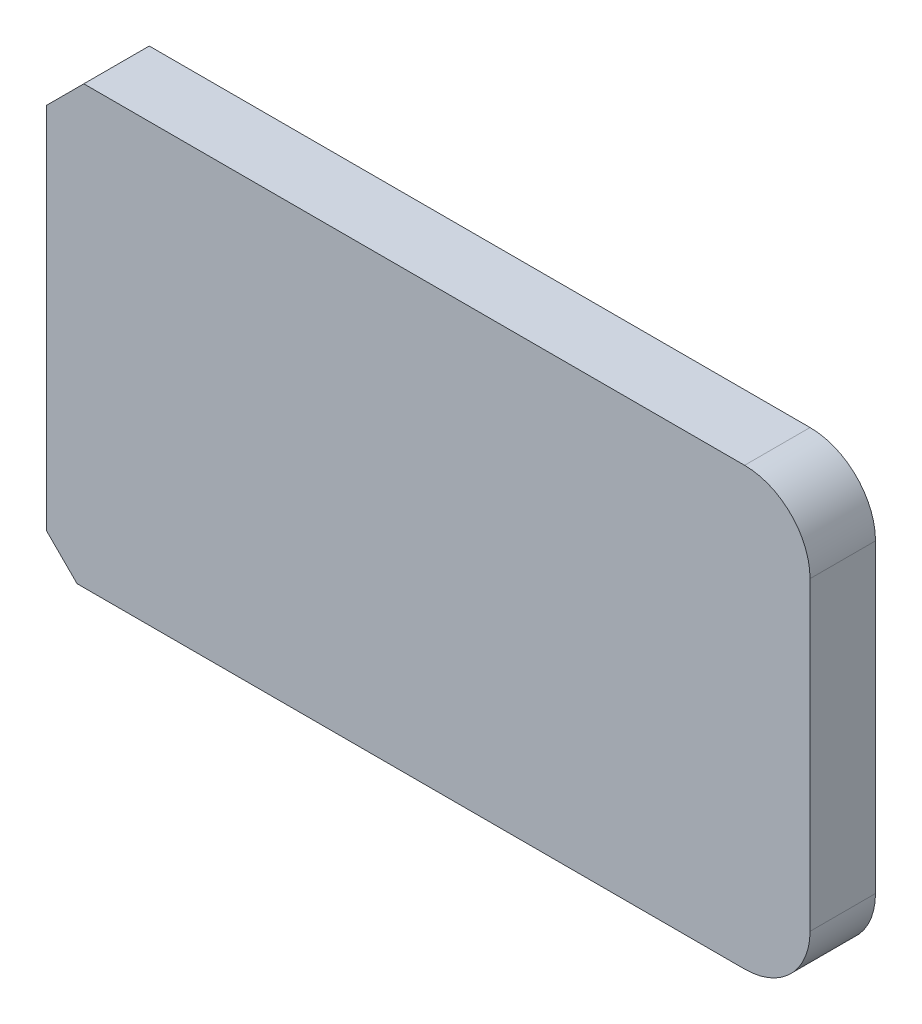
ISO-10303-21;
HEADER;
FILE_DESCRIPTION(('STEP AP214'),'2;1');
FILE_NAME('part.step','',(''),(''),'','','');
FILE_SCHEMA(('AUTOMOTIVE_DESIGN { 1 0 10303 214 1 1 1 1 }'));
ENDSEC;
DATA;
#1=APPLICATION_CONTEXT('core data for automotive mechanical design processes');
#2=APPLICATION_PROTOCOL_DEFINITION('international standard','automotive_design',2000,#1);
#3=PRODUCT_CONTEXT('',#1,'mechanical');
#4=PRODUCT('Part','Part','',(#3));
#5=PRODUCT_RELATED_PRODUCT_CATEGORY('part','',(#4));
#6=PRODUCT_DEFINITION_FORMATION('','',#4);
#7=PRODUCT_DEFINITION_CONTEXT('part definition',#1,'design');
#8=PRODUCT_DEFINITION('design','',#6,#7);
#9=PRODUCT_DEFINITION_SHAPE('','',#8);
#10=(LENGTH_UNIT() NAMED_UNIT(*) SI_UNIT(.MILLI.,.METRE.));
#11=(NAMED_UNIT(*) PLANE_ANGLE_UNIT() SI_UNIT($,.RADIAN.));
#12=(NAMED_UNIT(*) SI_UNIT($,.STERADIAN.) SOLID_ANGLE_UNIT());
#13=UNCERTAINTY_MEASURE_WITH_UNIT(LENGTH_MEASURE(1.E-05),#10,'distance_accuracy_value','');
#14=(GEOMETRIC_REPRESENTATION_CONTEXT(3) GLOBAL_UNCERTAINTY_ASSIGNED_CONTEXT((#13)) GLOBAL_UNIT_ASSIGNED_CONTEXT((#10,
#11,#12)) REPRESENTATION_CONTEXT('',''));
#15=CARTESIAN_POINT('',(0.,0.,0.));
#16=DIRECTION('',(0.,0.,1.));
#17=DIRECTION('',(1.,0.,0.));
#18=AXIS2_PLACEMENT_3D('',#15,#16,#17);
#19=CARTESIAN_POINT('',(-74.5424292845258,-25.0415973377704,12.));
#20=DIRECTION('',(1.,0.,0.));
#21=DIRECTION('',(0.,0.,-1.));
#22=AXIS2_PLACEMENT_3D('',#19,#20,#21);
#23=PLANE('',#22);
#24=DIRECTION('',(0.,-1.,0.));
#25=VECTOR('',#24,1.);
#26=CARTESIAN_POINT('',(-74.5424292845258,-25.0415973377704,0.));
#27=LINE('',#26,#25);
#28=CARTESIAN_POINT('',(-74.5424292845258,42.5124792013311,0.));
#29=VERTEX_POINT('',#28);
#30=CARTESIAN_POINT('',(-74.5424292845258,-25.0415973377704,0.));
#31=VERTEX_POINT('',#30);
#32=EDGE_CURVE('E133',#29,#31,#27,.T.);
#33=ORIENTED_EDGE('',*,*,#32,.T.);
#34=DIRECTION('',(0.,0.,-1.));
#35=VECTOR('',#34,1.);
#36=CARTESIAN_POINT('',(-74.5424292845258,-25.0415973377704,12.));
#37=LINE('',#36,#35);
#38=CARTESIAN_POINT('',(-74.5424292845258,-25.0415973377704,12.));
#39=VERTEX_POINT('',#38);
#40=EDGE_CURVE('E11',#39,#31,#37,.T.);
#41=ORIENTED_EDGE('',*,*,#40,.F.);
#42=DIRECTION('',(0.,-1.,0.));
#43=VECTOR('',#42,1.);
#44=CARTESIAN_POINT('',(-74.5424292845258,-25.0415973377704,12.));
#45=LINE('',#44,#43);
#46=CARTESIAN_POINT('',(-74.5424292845258,42.5124792013311,12.));
#47=VERTEX_POINT('',#46);
#48=EDGE_CURVE('E147',#47,#39,#45,.T.);
#49=ORIENTED_EDGE('',*,*,#48,.F.);
#50=DIRECTION('',(0.,0.,-1.));
#51=VECTOR('',#50,1.);
#52=CARTESIAN_POINT('',(-74.5424292845258,42.5124792013311,12.));
#53=LINE('',#52,#51);
#54=EDGE_CURVE('E129',#47,#29,#53,.T.);
#55=ORIENTED_EDGE('',*,*,#54,.T.);
#56=EDGE_LOOP('',(#33,#41,#49,#55));
#57=FACE_BOUND('',#56,.T.);
#58=ADVANCED_FACE('F37',(#57),#23,.F.);
#59=CARTESIAN_POINT('',(-68.9371081443863,-30.6469184779099,12.));
#60=DIRECTION('',(0.707106781186548,0.707106781186548,0.));
#61=DIRECTION('',(-0.707106781186548,0.707106781186548,0.));
#62=AXIS2_PLACEMENT_3D('',#59,#60,#61);
#63=PLANE('',#62);
#64=DIRECTION('',(0.707106781186547,-0.707106781186547,0.));
#65=VECTOR('',#64,1.);
#66=CARTESIAN_POINT('',(-68.9371081443863,-30.6469184779099,0.));
#67=LINE('',#66,#65);
#68=CARTESIAN_POINT('',(-68.9371081443863,-30.6469184779099,0.));
#69=VERTEX_POINT('',#68);
#70=EDGE_CURVE('E136',#31,#69,#67,.T.);
#71=ORIENTED_EDGE('',*,*,#70,.T.);
#72=DIRECTION('',(0.,0.,-1.));
#73=VECTOR('',#72,1.);
#74=CARTESIAN_POINT('',(-68.9371081443863,-30.6469184779099,12.));
#75=LINE('',#74,#73);
#76=CARTESIAN_POINT('',(-68.9371081443863,-30.6469184779099,12.));
#77=VERTEX_POINT('',#76);
#78=EDGE_CURVE('E45',#77,#69,#75,.T.);
#79=ORIENTED_EDGE('',*,*,#78,.F.);
#80=DIRECTION('',(0.707106781186547,-0.707106781186547,0.));
#81=VECTOR('',#80,1.);
#82=CARTESIAN_POINT('',(-68.9371081443863,-30.6469184779099,12.));
#83=LINE('',#82,#81);
#84=EDGE_CURVE('E96',#39,#77,#83,.T.);
#85=ORIENTED_EDGE('',*,*,#84,.F.);
#86=ORIENTED_EDGE('',*,*,#40,.T.);
#87=EDGE_LOOP('',(#71,#79,#85,#86));
#88=FACE_BOUND('',#87,.T.);
#89=ADVANCED_FACE('F182',(#88),#63,.F.);
#90=CARTESIAN_POINT('',(53.4575707154742,-30.6469184779099,12.));
#91=DIRECTION('',(0.,1.,0.));
#92=DIRECTION('',(-1.,0.,0.));
#93=AXIS2_PLACEMENT_3D('',#90,#91,#92);
#94=PLANE('',#93);
#95=DIRECTION('',(1.,0.,0.));
#96=VECTOR('',#95,1.);
#97=CARTESIAN_POINT('',(53.4575707154742,-30.6469184779099,0.));
#98=LINE('',#97,#96);
#99=CARTESIAN_POINT('',(53.4575707154742,-30.6469184779099,0.));
#100=VERTEX_POINT('',#99);
#101=EDGE_CURVE('E138',#69,#100,#98,.T.);
#102=ORIENTED_EDGE('',*,*,#101,.T.);
#103=DIRECTION('',(0.,0.,-1.));
#104=VECTOR('',#103,1.);
#105=CARTESIAN_POINT('',(53.4575707154742,-30.6469184779099,12.));
#106=LINE('',#105,#104);
#107=CARTESIAN_POINT('',(53.4575707154742,-30.6469184779099,12.));
#108=VERTEX_POINT('',#107);
#109=EDGE_CURVE('E154',#108,#100,#106,.T.);
#110=ORIENTED_EDGE('',*,*,#109,.F.);
#111=DIRECTION('',(1.,0.,0.));
#112=VECTOR('',#111,1.);
#113=CARTESIAN_POINT('',(53.4575707154742,-30.6469184779099,12.));
#114=LINE('',#113,#112);
#115=EDGE_CURVE('E162',#77,#108,#114,.T.);
#116=ORIENTED_EDGE('',*,*,#115,.F.);
#117=ORIENTED_EDGE('',*,*,#78,.T.);
#118=EDGE_LOOP('',(#102,#110,#116,#117));
#119=FACE_BOUND('',#118,.T.);
#120=ADVANCED_FACE('F160',(#119),#94,.F.);
#121=CARTESIAN_POINT('',(53.4575707154742,-18.6469184779099,12.));
#122=DIRECTION('',(0.,0.,-1.));
#123=DIRECTION('',(-1.,0.,0.));
#124=AXIS2_PLACEMENT_3D('',#121,#122,#123);
#125=CYLINDRICAL_SURFACE('',#124,12.);
#126=CARTESIAN_POINT('',(53.4575707154742,-18.6469184779099,0.));
#127=DIRECTION('',(0.,0.,1.));
#128=DIRECTION('',(-1.,0.,0.));
#129=AXIS2_PLACEMENT_3D('',#126,#127,#128);
#130=CIRCLE('',#129,12.);
#131=CARTESIAN_POINT('',(65.4575707154742,-18.6469184779098,0.));
#132=VERTEX_POINT('',#131);
#133=EDGE_CURVE('E140',#100,#132,#130,.T.);
#134=ORIENTED_EDGE('',*,*,#133,.T.);
#135=DIRECTION('',(0.,0.,-1.));
#136=VECTOR('',#135,1.);
#137=CARTESIAN_POINT('',(65.4575707154742,-18.6469184779098,12.));
#138=LINE('',#137,#136);
#139=CARTESIAN_POINT('',(65.4575707154742,-18.6469184779098,12.));
#140=VERTEX_POINT('',#139);
#141=EDGE_CURVE('E151',#140,#132,#138,.T.);
#142=ORIENTED_EDGE('',*,*,#141,.F.);
#143=CARTESIAN_POINT('',(53.4575707154742,-18.6469184779099,12.));
#144=DIRECTION('',(0.,0.,1.));
#145=DIRECTION('',(-1.,0.,0.));
#146=AXIS2_PLACEMENT_3D('',#143,#144,#145);
#147=CIRCLE('',#146,12.);
#148=EDGE_CURVE('E174',#108,#140,#147,.T.);
#149=ORIENTED_EDGE('',*,*,#148,.F.);
#150=ORIENTED_EDGE('',*,*,#109,.T.);
#151=EDGE_LOOP('',(#134,#142,#149,#150));
#152=FACE_BOUND('',#151,.T.);
#153=ADVANCED_FACE('F170',(#152),#125,.T.);
#154=CARTESIAN_POINT('',(65.4575707154742,37.35308152209,12.));
#155=DIRECTION('',(-1.,0.,0.));
#156=DIRECTION('',(0.,-1.,0.));
#157=AXIS2_PLACEMENT_3D('',#154,#155,#156);
#158=PLANE('',#157);
#159=DIRECTION('',(0.,1.,0.));
#160=VECTOR('',#159,1.);
#161=CARTESIAN_POINT('',(65.4575707154742,37.35308152209,0.));
#162=LINE('',#161,#160);
#163=CARTESIAN_POINT('',(65.4575707154742,37.35308152209,0.));
#164=VERTEX_POINT('',#163);
#165=EDGE_CURVE('E142',#132,#164,#162,.T.);
#166=ORIENTED_EDGE('',*,*,#165,.T.);
#167=DIRECTION('',(0.,0.,-1.));
#168=VECTOR('',#167,1.);
#169=CARTESIAN_POINT('',(65.4575707154742,37.35308152209,12.));
#170=LINE('',#169,#168);
#171=CARTESIAN_POINT('',(65.4575707154742,37.35308152209,12.));
#172=VERTEX_POINT('',#171);
#173=EDGE_CURVE('E124',#172,#164,#170,.T.);
#174=ORIENTED_EDGE('',*,*,#173,.F.);
#175=DIRECTION('',(0.,1.,0.));
#176=VECTOR('',#175,1.);
#177=CARTESIAN_POINT('',(65.4575707154742,37.35308152209,12.));
#178=LINE('',#177,#176);
#179=EDGE_CURVE('E115',#140,#172,#178,.T.);
#180=ORIENTED_EDGE('',*,*,#179,.F.);
#181=ORIENTED_EDGE('',*,*,#141,.T.);
#182=EDGE_LOOP('',(#166,#174,#180,#181));
#183=FACE_BOUND('',#182,.T.);
#184=ADVANCED_FACE('F173',(#183),#158,.F.);
#185=CARTESIAN_POINT('',(53.4575707154742,37.3530815220901,12.));
#186=DIRECTION('',(0.,0.,-1.));
#187=DIRECTION('',(-1.,0.,0.));
#188=AXIS2_PLACEMENT_3D('',#185,#186,#187);
#189=CYLINDRICAL_SURFACE('',#188,12.);
#190=CARTESIAN_POINT('',(53.4575707154742,37.3530815220901,0.));
#191=DIRECTION('',(0.,0.,1.));
#192=DIRECTION('',(-1.,0.,0.));
#193=AXIS2_PLACEMENT_3D('',#190,#191,#192);
#194=CIRCLE('',#193,12.);
#195=CARTESIAN_POINT('',(53.4575707154741,49.3530815220901,0.));
#196=VERTEX_POINT('',#195);
#197=EDGE_CURVE('E123',#164,#196,#194,.T.);
#198=ORIENTED_EDGE('',*,*,#197,.T.);
#199=DIRECTION('',(0.,0.,-1.));
#200=VECTOR('',#199,1.);
#201=CARTESIAN_POINT('',(53.4575707154741,49.3530815220901,12.));
#202=LINE('',#201,#200);
#203=CARTESIAN_POINT('',(53.4575707154741,49.3530815220901,12.));
#204=VERTEX_POINT('',#203);
#205=EDGE_CURVE('E120',#204,#196,#202,.T.);
#206=ORIENTED_EDGE('',*,*,#205,.F.);
#207=CARTESIAN_POINT('',(53.4575707154742,37.3530815220901,12.));
#208=DIRECTION('',(0.,0.,1.));
#209=DIRECTION('',(-1.,0.,0.));
#210=AXIS2_PLACEMENT_3D('',#207,#208,#209);
#211=CIRCLE('',#210,12.);
#212=EDGE_CURVE('E109',#172,#204,#211,.T.);
#213=ORIENTED_EDGE('',*,*,#212,.F.);
#214=ORIENTED_EDGE('',*,*,#173,.T.);
#215=EDGE_LOOP('',(#198,#206,#213,#214));
#216=FACE_BOUND('',#215,.T.);
#217=ADVANCED_FACE('F121',(#216),#189,.T.);
#218=CARTESIAN_POINT('',(-67.7018269637668,49.3530815220901,12.));
#219=DIRECTION('',(0.,-1.,0.));
#220=DIRECTION('',(1.,0.,0.));
#221=AXIS2_PLACEMENT_3D('',#218,#219,#220);
#222=PLANE('',#221);
#223=DIRECTION('',(-1.,0.,0.));
#224=VECTOR('',#223,1.);
#225=CARTESIAN_POINT('',(-67.7018269637668,49.3530815220901,0.));
#226=LINE('',#225,#224);
#227=CARTESIAN_POINT('',(-67.7018269637668,49.3530815220901,0.));
#228=VERTEX_POINT('',#227);
#229=EDGE_CURVE('E82',#196,#228,#226,.T.);
#230=ORIENTED_EDGE('',*,*,#229,.T.);
#231=DIRECTION('',(0.,0.,-1.));
#232=VECTOR('',#231,1.);
#233=CARTESIAN_POINT('',(-67.7018269637668,49.3530815220901,12.));
#234=LINE('',#233,#232);
#235=CARTESIAN_POINT('',(-67.7018269637668,49.3530815220901,12.));
#236=VERTEX_POINT('',#235);
#237=EDGE_CURVE('E125',#236,#228,#234,.T.);
#238=ORIENTED_EDGE('',*,*,#237,.F.);
#239=DIRECTION('',(-1.,0.,0.));
#240=VECTOR('',#239,1.);
#241=CARTESIAN_POINT('',(-67.7018269637668,49.3530815220901,12.));
#242=LINE('',#241,#240);
#243=EDGE_CURVE('E113',#204,#236,#242,.T.);
#244=ORIENTED_EDGE('',*,*,#243,.F.);
#245=ORIENTED_EDGE('',*,*,#205,.T.);
#246=EDGE_LOOP('',(#230,#238,#244,#245));
#247=FACE_BOUND('',#246,.T.);
#248=ADVANCED_FACE('F127',(#247),#222,.F.);
#249=CARTESIAN_POINT('',(-74.5424292845258,42.5124792013311,12.));
#250=DIRECTION('',(0.70710678118655,-0.707106781186545,0.));
#251=DIRECTION('',(0.707106781186545,0.70710678118655,0.));
#252=AXIS2_PLACEMENT_3D('',#249,#250,#251);
#253=PLANE('',#252);
#254=DIRECTION('',(-0.707106781186545,-0.70710678118655,0.));
#255=VECTOR('',#254,1.);
#256=CARTESIAN_POINT('',(-74.5424292845258,42.5124792013311,0.));
#257=LINE('',#256,#255);
#258=EDGE_CURVE('E88',#228,#29,#257,.T.);
#259=ORIENTED_EDGE('',*,*,#258,.T.);
#260=ORIENTED_EDGE('',*,*,#54,.F.);
#261=DIRECTION('',(-0.707106781186545,-0.70710678118655,0.));
#262=VECTOR('',#261,1.);
#263=CARTESIAN_POINT('',(-74.5424292845258,42.5124792013311,12.));
#264=LINE('',#263,#262);
#265=EDGE_CURVE('E53',#236,#47,#264,.T.);
#266=ORIENTED_EDGE('',*,*,#265,.F.);
#267=ORIENTED_EDGE('',*,*,#237,.T.);
#268=EDGE_LOOP('',(#259,#260,#266,#267));
#269=FACE_BOUND('',#268,.T.);
#270=ADVANCED_FACE('F198',(#269),#253,.F.);
#271=CARTESIAN_POINT('',(53.4575707154742,37.3530815220901,12.));
#272=DIRECTION('',(0.,0.,-1.));
#273=DIRECTION('',(-1.,0.,0.));
#274=AXIS2_PLACEMENT_3D('',#271,#272,#273);
#275=PLANE('',#274);
#276=ORIENTED_EDGE('',*,*,#48,.T.);
#277=ORIENTED_EDGE('',*,*,#84,.T.);
#278=ORIENTED_EDGE('',*,*,#115,.T.);
#279=ORIENTED_EDGE('',*,*,#148,.T.);
#280=ORIENTED_EDGE('',*,*,#179,.T.);
#281=ORIENTED_EDGE('',*,*,#212,.T.);
#282=ORIENTED_EDGE('',*,*,#243,.T.);
#283=ORIENTED_EDGE('',*,*,#265,.T.);
#284=EDGE_LOOP('',(#276,#277,#278,#279,#280,#281,#282,#283));
#285=FACE_BOUND('',#284,.T.);
#286=ADVANCED_FACE('F111',(#285),#275,.F.);
#287=CARTESIAN_POINT('',(53.4575707154742,37.3530815220901,0.));
#288=DIRECTION('',(0.,0.,-1.));
#289=DIRECTION('',(-1.,0.,0.));
#290=AXIS2_PLACEMENT_3D('',#287,#288,#289);
#291=PLANE('',#290);
#292=ORIENTED_EDGE('',*,*,#32,.F.);
#293=ORIENTED_EDGE('',*,*,#258,.F.);
#294=ORIENTED_EDGE('',*,*,#229,.F.);
#295=ORIENTED_EDGE('',*,*,#197,.F.);
#296=ORIENTED_EDGE('',*,*,#165,.F.);
#297=ORIENTED_EDGE('',*,*,#133,.F.);
#298=ORIENTED_EDGE('',*,*,#101,.F.);
#299=ORIENTED_EDGE('',*,*,#70,.F.);
#300=EDGE_LOOP('',(#292,#293,#294,#295,#296,#297,#298,#299));
#301=FACE_BOUND('',#300,.T.);
#302=ADVANCED_FACE('F166',(#301),#291,.T.);
#303=CLOSED_SHELL('',(#58,#89,#120,#153,#184,#217,#248,#270,#286,#302));
#304=MANIFOLD_SOLID_BREP('B2',#303);
#305=ADVANCED_BREP_SHAPE_REPRESENTATION('',(#18,#304),#14);
#306=SHAPE_DEFINITION_REPRESENTATION(#9,#305);
ENDSEC;
END-ISO-10303-21;
